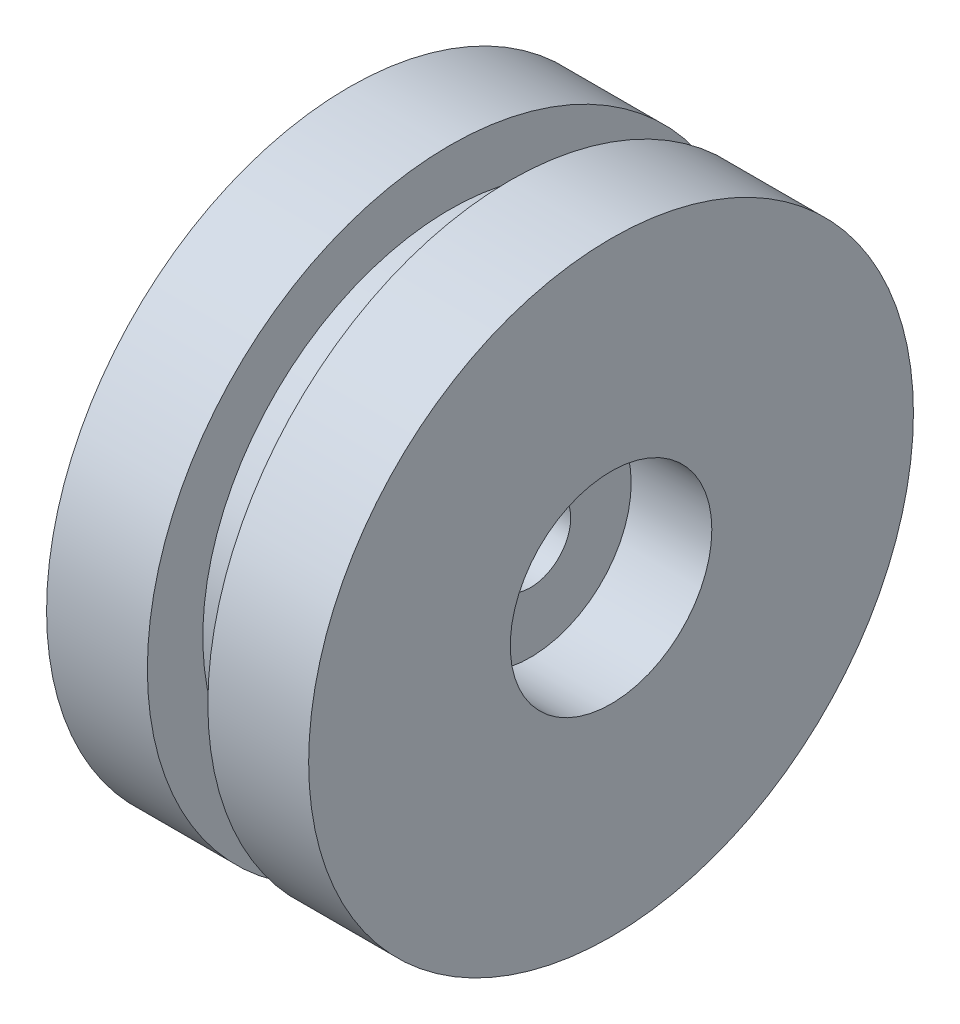
ISO-10303-21;
HEADER;
FILE_DESCRIPTION(('STEP AP214'),'2;1');
FILE_NAME('part.step','',(''),(''),'','','');
FILE_SCHEMA(('AUTOMOTIVE_DESIGN { 1 0 10303 214 1 1 1 1 }'));
ENDSEC;
DATA;
#1=APPLICATION_CONTEXT('core data for automotive mechanical design processes');
#2=APPLICATION_PROTOCOL_DEFINITION('international standard','automotive_design',2000,#1);
#3=PRODUCT_CONTEXT('',#1,'mechanical');
#4=PRODUCT('Part','Part','',(#3));
#5=PRODUCT_RELATED_PRODUCT_CATEGORY('part','',(#4));
#6=PRODUCT_DEFINITION_FORMATION('','',#4);
#7=PRODUCT_DEFINITION_CONTEXT('part definition',#1,'design');
#8=PRODUCT_DEFINITION('design','',#6,#7);
#9=PRODUCT_DEFINITION_SHAPE('','',#8);
#10=(LENGTH_UNIT() NAMED_UNIT(*) SI_UNIT(.MILLI.,.METRE.));
#11=(NAMED_UNIT(*) PLANE_ANGLE_UNIT() SI_UNIT($,.RADIAN.));
#12=(NAMED_UNIT(*) SI_UNIT($,.STERADIAN.) SOLID_ANGLE_UNIT());
#13=UNCERTAINTY_MEASURE_WITH_UNIT(LENGTH_MEASURE(1.E-05),#10,'distance_accuracy_value','');
#14=(GEOMETRIC_REPRESENTATION_CONTEXT(3) GLOBAL_UNCERTAINTY_ASSIGNED_CONTEXT((#13)) GLOBAL_UNIT_ASSIGNED_CONTEXT((#10,
#11,#12)) REPRESENTATION_CONTEXT('',''));
#15=CARTESIAN_POINT('',(0.,0.,0.));
#16=DIRECTION('',(0.,0.,1.));
#17=DIRECTION('',(1.,0.,0.));
#18=AXIS2_PLACEMENT_3D('',#15,#16,#17);
#19=CARTESIAN_POINT('',(6.5,0.,0.));
#20=DIRECTION('',(1.,0.,0.));
#21=DIRECTION('',(0.,0.,-1.));
#22=AXIS2_PLACEMENT_3D('',#19,#20,#21);
#23=CYLINDRICAL_SURFACE('',#22,15.);
#24=CARTESIAN_POINT('',(-6.5,0.,0.));
#25=DIRECTION('',(1.,0.,0.));
#26=DIRECTION('',(0.,0.,-1.));
#27=AXIS2_PLACEMENT_3D('',#24,#25,#26);
#28=CIRCLE('',#27,15.);
#29=CARTESIAN_POINT('',(-6.5,0.,-15.));
#30=VERTEX_POINT('',#29);
#31=EDGE_CURVE('E10',#30,#30,#28,.T.);
#32=ORIENTED_EDGE('',*,*,#31,.T.);
#33=EDGE_LOOP('',(#32));
#34=FACE_BOUND('',#33,.T.);
#35=CARTESIAN_POINT('',(-1.5,0.,0.));
#36=DIRECTION('',(1.,0.,0.));
#37=DIRECTION('',(0.,0.,-1.));
#38=AXIS2_PLACEMENT_3D('',#35,#36,#37);
#39=CIRCLE('',#38,15.);
#40=CARTESIAN_POINT('',(-1.5,0.,-15.));
#41=VERTEX_POINT('',#40);
#42=EDGE_CURVE('E57',#41,#41,#39,.T.);
#43=ORIENTED_EDGE('',*,*,#42,.F.);
#44=EDGE_LOOP('',(#43));
#45=FACE_BOUND('',#44,.T.);
#46=ADVANCED_FACE('F35',(#34,#45),#23,.T.);
#47=CARTESIAN_POINT('',(-6.5,15.,0.));
#48=DIRECTION('',(-1.,0.,0.));
#49=DIRECTION('',(0.,0.,1.));
#50=AXIS2_PLACEMENT_3D('',#47,#48,#49);
#51=PLANE('',#50);
#52=CARTESIAN_POINT('',(-6.5,0.,0.));
#53=DIRECTION('',(-1.,0.,0.));
#54=DIRECTION('',(0.,0.,1.));
#55=AXIS2_PLACEMENT_3D('',#52,#53,#54);
#56=CIRCLE('',#55,2.5);
#57=CARTESIAN_POINT('',(-6.5,0.,2.5));
#58=VERTEX_POINT('',#57);
#59=EDGE_CURVE('E70',#58,#58,#56,.T.);
#60=ORIENTED_EDGE('',*,*,#59,.F.);
#61=EDGE_LOOP('',(#60));
#62=FACE_BOUND('',#61,.T.);
#63=ORIENTED_EDGE('',*,*,#31,.F.);
#64=EDGE_LOOP('',(#63));
#65=FACE_BOUND('',#64,.T.);
#66=ADVANCED_FACE('F85',(#62,#65),#51,.T.);
#67=CARTESIAN_POINT('',(6.5,15.,0.));
#68=DIRECTION('',(1.,0.,0.));
#69=DIRECTION('',(0.,0.,-1.));
#70=AXIS2_PLACEMENT_3D('',#67,#68,#69);
#71=PLANE('',#70);
#72=CARTESIAN_POINT('',(6.5,0.,0.));
#73=DIRECTION('',(1.,0.,0.));
#74=DIRECTION('',(0.,0.,-1.));
#75=AXIS2_PLACEMENT_3D('',#72,#73,#74);
#76=CIRCLE('',#75,5.);
#77=CARTESIAN_POINT('',(6.5,0.,-5.));
#78=VERTEX_POINT('',#77);
#79=EDGE_CURVE('E61',#78,#78,#76,.T.);
#80=ORIENTED_EDGE('',*,*,#79,.F.);
#81=EDGE_LOOP('',(#80));
#82=FACE_BOUND('',#81,.T.);
#83=CARTESIAN_POINT('',(6.5,0.,0.));
#84=DIRECTION('',(1.,0.,0.));
#85=DIRECTION('',(0.,0.,-1.));
#86=AXIS2_PLACEMENT_3D('',#83,#84,#85);
#87=CIRCLE('',#86,15.);
#88=CARTESIAN_POINT('',(6.5,0.,-15.));
#89=VERTEX_POINT('',#88);
#90=EDGE_CURVE('E42',#89,#89,#87,.T.);
#91=ORIENTED_EDGE('',*,*,#90,.T.);
#92=EDGE_LOOP('',(#91));
#93=FACE_BOUND('',#92,.T.);
#94=ADVANCED_FACE('F88',(#82,#93),#71,.T.);
#95=CARTESIAN_POINT('',(6.5,0.,0.));
#96=DIRECTION('',(1.,0.,0.));
#97=DIRECTION('',(0.,0.,-1.));
#98=AXIS2_PLACEMENT_3D('',#95,#96,#97);
#99=CYLINDRICAL_SURFACE('',#98,15.);
#100=CARTESIAN_POINT('',(1.5,0.,0.));
#101=DIRECTION('',(1.,0.,0.));
#102=DIRECTION('',(0.,0.,-1.));
#103=AXIS2_PLACEMENT_3D('',#100,#101,#102);
#104=CIRCLE('',#103,15.);
#105=CARTESIAN_POINT('',(1.5,0.,-15.));
#106=VERTEX_POINT('',#105);
#107=EDGE_CURVE('E46',#106,#106,#104,.T.);
#108=ORIENTED_EDGE('',*,*,#107,.T.);
#109=EDGE_LOOP('',(#108));
#110=FACE_BOUND('',#109,.T.);
#111=ORIENTED_EDGE('',*,*,#90,.F.);
#112=EDGE_LOOP('',(#111));
#113=FACE_BOUND('',#112,.T.);
#114=ADVANCED_FACE('F93',(#110,#113),#99,.T.);
#115=CARTESIAN_POINT('',(1.5,15.,0.));
#116=DIRECTION('',(-1.,0.,0.));
#117=DIRECTION('',(0.,0.,1.));
#118=AXIS2_PLACEMENT_3D('',#115,#116,#117);
#119=PLANE('',#118);
#120=CARTESIAN_POINT('',(1.5,0.,0.));
#121=DIRECTION('',(1.,0.,0.));
#122=DIRECTION('',(0.,0.,-1.));
#123=AXIS2_PLACEMENT_3D('',#120,#121,#122);
#124=CIRCLE('',#123,12.25);
#125=CARTESIAN_POINT('',(1.5,0.,-12.25));
#126=VERTEX_POINT('',#125);
#127=EDGE_CURVE('E51',#126,#126,#124,.T.);
#128=ORIENTED_EDGE('',*,*,#127,.T.);
#129=EDGE_LOOP('',(#128));
#130=FACE_BOUND('',#129,.T.);
#131=ORIENTED_EDGE('',*,*,#107,.F.);
#132=EDGE_LOOP('',(#131));
#133=FACE_BOUND('',#132,.T.);
#134=ADVANCED_FACE('F99',(#130,#133),#119,.T.);
#135=CARTESIAN_POINT('',(6.5,0.,0.));
#136=DIRECTION('',(1.,0.,0.));
#137=DIRECTION('',(0.,0.,-1.));
#138=AXIS2_PLACEMENT_3D('',#135,#136,#137);
#139=CYLINDRICAL_SURFACE('',#138,12.25);
#140=CARTESIAN_POINT('',(-1.5,0.,0.));
#141=DIRECTION('',(1.,0.,0.));
#142=DIRECTION('',(0.,0.,-1.));
#143=AXIS2_PLACEMENT_3D('',#140,#141,#142);
#144=CIRCLE('',#143,12.25);
#145=CARTESIAN_POINT('',(-1.5,0.,-12.25));
#146=VERTEX_POINT('',#145);
#147=EDGE_CURVE('E54',#146,#146,#144,.T.);
#148=ORIENTED_EDGE('',*,*,#147,.T.);
#149=EDGE_LOOP('',(#148));
#150=FACE_BOUND('',#149,.T.);
#151=ORIENTED_EDGE('',*,*,#127,.F.);
#152=EDGE_LOOP('',(#151));
#153=FACE_BOUND('',#152,.T.);
#154=ADVANCED_FACE('F103',(#150,#153),#139,.T.);
#155=CARTESIAN_POINT('',(-1.5,15.,0.));
#156=DIRECTION('',(1.,0.,0.));
#157=DIRECTION('',(0.,0.,-1.));
#158=AXIS2_PLACEMENT_3D('',#155,#156,#157);
#159=PLANE('',#158);
#160=ORIENTED_EDGE('',*,*,#42,.T.);
#161=EDGE_LOOP('',(#160));
#162=FACE_BOUND('',#161,.T.);
#163=ORIENTED_EDGE('',*,*,#147,.F.);
#164=EDGE_LOOP('',(#163));
#165=FACE_BOUND('',#164,.T.);
#166=ADVANCED_FACE('F107',(#162,#165),#159,.T.);
#167=CARTESIAN_POINT('',(2.5,0.,0.));
#168=DIRECTION('',(1.,0.,0.));
#169=DIRECTION('',(0.,0.,-1.));
#170=AXIS2_PLACEMENT_3D('',#167,#168,#169);
#171=CYLINDRICAL_SURFACE('',#170,5.);
#172=CARTESIAN_POINT('',(2.5,0.,0.));
#173=DIRECTION('',(1.,0.,0.));
#174=DIRECTION('',(0.,0.,-1.));
#175=AXIS2_PLACEMENT_3D('',#172,#173,#174);
#176=CIRCLE('',#175,5.);
#177=CARTESIAN_POINT('',(2.5,0.,-5.));
#178=VERTEX_POINT('',#177);
#179=EDGE_CURVE('E60',#178,#178,#176,.T.);
#180=ORIENTED_EDGE('',*,*,#179,.F.);
#181=EDGE_LOOP('',(#180));
#182=FACE_BOUND('',#181,.T.);
#183=ORIENTED_EDGE('',*,*,#79,.T.);
#184=EDGE_LOOP('',(#183));
#185=FACE_BOUND('',#184,.T.);
#186=ADVANCED_FACE('F111',(#182,#185),#171,.F.);
#187=CARTESIAN_POINT('',(2.5,0.,0.));
#188=DIRECTION('',(1.,0.,0.));
#189=DIRECTION('',(0.,0.,-1.));
#190=AXIS2_PLACEMENT_3D('',#187,#188,#189);
#191=PLANE('',#190);
#192=CARTESIAN_POINT('',(2.5,0.,0.));
#193=DIRECTION('',(1.,0.,0.));
#194=DIRECTION('',(0.,0.,-1.));
#195=AXIS2_PLACEMENT_3D('',#192,#193,#194);
#196=CIRCLE('',#195,2.);
#197=CARTESIAN_POINT('',(2.5,0.,-2.));
#198=VERTEX_POINT('',#197);
#199=EDGE_CURVE('E38',#198,#198,#196,.T.);
#200=ORIENTED_EDGE('',*,*,#199,.F.);
#201=EDGE_LOOP('',(#200));
#202=FACE_BOUND('',#201,.T.);
#203=ORIENTED_EDGE('',*,*,#179,.T.);
#204=EDGE_LOOP('',(#203));
#205=FACE_BOUND('',#204,.T.);
#206=ADVANCED_FACE('F115',(#202,#205),#191,.T.);
#207=CARTESIAN_POINT('',(0.,0.,0.));
#208=DIRECTION('',(1.,0.,0.));
#209=DIRECTION('',(0.,0.,-1.));
#210=AXIS2_PLACEMENT_3D('',#207,#208,#209);
#211=CYLINDRICAL_SURFACE('',#210,2.);
#212=CARTESIAN_POINT('',(0.,0.,0.));
#213=DIRECTION('',(1.,0.,0.));
#214=DIRECTION('',(0.,0.,-1.));
#215=AXIS2_PLACEMENT_3D('',#212,#213,#214);
#216=CIRCLE('',#215,2.);
#217=CARTESIAN_POINT('',(0.,0.,-2.));
#218=VERTEX_POINT('',#217);
#219=EDGE_CURVE('E66',#218,#218,#216,.T.);
#220=CARTESIAN_POINT('',(2.5,0.,-2.));
#221=CARTESIAN_POINT('',(2.47395833333333,0.,-2.));
#222=CARTESIAN_POINT('',(2.44791666666667,0.,-2.));
#223=CARTESIAN_POINT('',(2.39583333333333,0.,-2.));
#224=CARTESIAN_POINT('',(2.36979166666667,0.,-2.));
#225=CARTESIAN_POINT('',(2.31770833333333,0.,-2.));
#226=CARTESIAN_POINT('',(2.29166666666667,0.,-2.));
#227=CARTESIAN_POINT('',(2.23958333333333,0.,-2.));
#228=CARTESIAN_POINT('',(2.21354166666667,0.,-2.));
#229=CARTESIAN_POINT('',(2.16145833333333,0.,-2.));
#230=CARTESIAN_POINT('',(2.13541666666667,0.,-2.));
#231=CARTESIAN_POINT('',(2.08333333333333,0.,-2.));
#232=CARTESIAN_POINT('',(2.05729166666667,0.,-2.));
#233=CARTESIAN_POINT('',(2.00520833333333,0.,-2.));
#234=CARTESIAN_POINT('',(1.97916666666667,0.,-2.));
#235=CARTESIAN_POINT('',(1.92708333333333,0.,-2.));
#236=CARTESIAN_POINT('',(1.90104166666667,0.,-2.));
#237=CARTESIAN_POINT('',(1.84895833333333,0.,-2.));
#238=CARTESIAN_POINT('',(1.82291666666667,0.,-2.));
#239=CARTESIAN_POINT('',(1.77083333333333,0.,-2.));
#240=CARTESIAN_POINT('',(1.74479166666667,0.,-2.));
#241=CARTESIAN_POINT('',(1.69270833333333,0.,-2.));
#242=CARTESIAN_POINT('',(1.66666666666667,0.,-2.));
#243=CARTESIAN_POINT('',(1.61458333333333,0.,-2.));
#244=CARTESIAN_POINT('',(1.58854166666667,0.,-2.));
#245=CARTESIAN_POINT('',(1.53645833333333,0.,-2.));
#246=CARTESIAN_POINT('',(1.51041666666667,0.,-2.));
#247=CARTESIAN_POINT('',(1.45833333333333,0.,-2.));
#248=CARTESIAN_POINT('',(1.43229166666667,0.,-2.));
#249=CARTESIAN_POINT('',(1.38020833333333,0.,-2.));
#250=CARTESIAN_POINT('',(1.35416666666667,0.,-2.));
#251=CARTESIAN_POINT('',(1.30208333333333,0.,-2.));
#252=CARTESIAN_POINT('',(1.27604166666667,0.,-2.));
#253=CARTESIAN_POINT('',(1.22395833333333,0.,-2.));
#254=CARTESIAN_POINT('',(1.19791666666667,0.,-2.));
#255=CARTESIAN_POINT('',(1.14583333333333,0.,-2.));
#256=CARTESIAN_POINT('',(1.11979166666667,0.,-2.));
#257=CARTESIAN_POINT('',(1.06770833333333,0.,-2.));
#258=CARTESIAN_POINT('',(1.04166666666667,0.,-2.));
#259=CARTESIAN_POINT('',(0.989583333333333,0.,-2.));
#260=CARTESIAN_POINT('',(0.963541666666667,0.,-2.));
#261=CARTESIAN_POINT('',(0.911458333333333,0.,-2.));
#262=CARTESIAN_POINT('',(0.885416666666667,0.,-2.));
#263=CARTESIAN_POINT('',(0.833333333333333,0.,-2.));
#264=CARTESIAN_POINT('',(0.807291666666666,0.,-2.));
#265=CARTESIAN_POINT('',(0.755208333333333,0.,-2.));
#266=CARTESIAN_POINT('',(0.729166666666667,0.,-2.));
#267=CARTESIAN_POINT('',(0.677083333333333,0.,-2.));
#268=CARTESIAN_POINT('',(0.651041666666667,0.,-2.));
#269=CARTESIAN_POINT('',(0.598958333333333,0.,-2.));
#270=CARTESIAN_POINT('',(0.572916666666666,0.,-2.));
#271=CARTESIAN_POINT('',(0.520833333333333,0.,-2.));
#272=CARTESIAN_POINT('',(0.494791666666667,0.,-2.));
#273=CARTESIAN_POINT('',(0.442708333333333,0.,-2.));
#274=CARTESIAN_POINT('',(0.416666666666667,0.,-2.));
#275=CARTESIAN_POINT('',(0.364583333333333,0.,-2.));
#276=CARTESIAN_POINT('',(0.338541666666666,0.,-2.));
#277=CARTESIAN_POINT('',(0.286458333333333,0.,-2.));
#278=CARTESIAN_POINT('',(0.260416666666666,0.,-2.));
#279=CARTESIAN_POINT('',(0.208333333333333,0.,-2.));
#280=CARTESIAN_POINT('',(0.182291666666667,0.,-2.));
#281=CARTESIAN_POINT('',(0.130208333333333,0.,-2.));
#282=CARTESIAN_POINT('',(0.104166666666667,0.,-2.));
#283=CARTESIAN_POINT('',(0.0520833333333334,0.,-2.));
#284=CARTESIAN_POINT('',(0.0260416666666667,0.,-2.));
#285=CARTESIAN_POINT('',(0.,0.,-2.));
#286=B_SPLINE_CURVE_WITH_KNOTS('',3,(#220,#221,#222,#223,#224,#225,#226,#227,#228,#229,#230,
#231,#232,#233,#234,#235,#236,#237,#238,#239,#240,#241,#242,#243,#244,#245,#246,#247,#248,#249,
#250,#251,#252,#253,#254,#255,#256,#257,#258,#259,#260,#261,#262,#263,#264,#265,#266,#267,#268,
#269,#270,#271,#272,#273,#274,#275,#276,#277,#278,#279,#280,#281,#282,#283,#284,#285),
.UNSPECIFIED.,.F.,.F.,(4,2,2,2,2,2,2,2,2,2,2,2,2,2,2,2,2,2,2,2,2,2,2,2,2,2,2,2,2,2,2,2,4),(0.,
0.0781250000000001,0.15625,0.234375,0.3125,0.390625,0.46875,0.546875,0.625,0.703125,0.78125,
0.859375,0.9375,1.015625,1.09375,1.171875,1.25,1.328125,1.40625,1.484375,1.5625,1.640625,
1.71875,1.796875,1.875,1.953125,2.03125,2.109375,2.1875,2.265625,2.34375,2.421875,2.5),.UNSPECIFIED.);
#287=EDGE_CURVE('BSEAM119',#198,#218,#286,.T.);
#288=ORIENTED_EDGE('',*,*,#199,.T.);
#289=ORIENTED_EDGE('',*,*,#219,.F.);
#290=ORIENTED_EDGE('',*,*,#287,.T.);
#291=ORIENTED_EDGE('',*,*,#287,.F.);
#292=EDGE_LOOP('',(#288,#290,#289,#291));
#293=FACE_BOUND('',#292,.T.);
#294=ADVANCED_FACE('F119',(#293),#211,.F.);
#295=CARTESIAN_POINT('',(0.,0.,0.));
#296=DIRECTION('',(-1.,0.,0.));
#297=DIRECTION('',(0.,0.,1.));
#298=AXIS2_PLACEMENT_3D('',#295,#296,#297);
#299=PLANE('',#298);
#300=CARTESIAN_POINT('',(0.,0.,0.));
#301=DIRECTION('',(-1.,0.,0.));
#302=DIRECTION('',(0.,0.,1.));
#303=AXIS2_PLACEMENT_3D('',#300,#301,#302);
#304=CIRCLE('',#303,2.5);
#305=CARTESIAN_POINT('',(0.,0.,2.5));
#306=VERTEX_POINT('',#305);
#307=EDGE_CURVE('E69',#306,#306,#304,.T.);
#308=ORIENTED_EDGE('',*,*,#307,.T.);
#309=EDGE_LOOP('',(#308));
#310=FACE_BOUND('',#309,.T.);
#311=ORIENTED_EDGE('',*,*,#219,.T.);
#312=EDGE_LOOP('',(#311));
#313=FACE_BOUND('',#312,.T.);
#314=ADVANCED_FACE('F76',(#310,#313),#299,.T.);
#315=CARTESIAN_POINT('',(0.,0.,0.));
#316=DIRECTION('',(-1.,0.,0.));
#317=DIRECTION('',(0.,0.,1.));
#318=AXIS2_PLACEMENT_3D('',#315,#316,#317);
#319=CYLINDRICAL_SURFACE('',#318,2.5);
#320=CARTESIAN_POINT('',(0.,0.,2.5));
#321=CARTESIAN_POINT('',(-0.0677083333333332,0.,2.5));
#322=CARTESIAN_POINT('',(-0.135416666666667,0.,2.5));
#323=CARTESIAN_POINT('',(-0.270833333333333,0.,2.5));
#324=CARTESIAN_POINT('',(-0.338541666666667,0.,2.5));
#325=CARTESIAN_POINT('',(-0.473958333333333,0.,2.5));
#326=CARTESIAN_POINT('',(-0.541666666666667,0.,2.5));
#327=CARTESIAN_POINT('',(-0.677083333333333,0.,2.5));
#328=CARTESIAN_POINT('',(-0.744791666666667,0.,2.5));
#329=CARTESIAN_POINT('',(-0.880208333333333,0.,2.5));
#330=CARTESIAN_POINT('',(-0.947916666666667,0.,2.5));
#331=CARTESIAN_POINT('',(-1.08333333333333,0.,2.5));
#332=CARTESIAN_POINT('',(-1.15104166666667,0.,2.5));
#333=CARTESIAN_POINT('',(-1.28645833333333,0.,2.5));
#334=CARTESIAN_POINT('',(-1.35416666666667,0.,2.5));
#335=CARTESIAN_POINT('',(-1.48958333333333,0.,2.5));
#336=CARTESIAN_POINT('',(-1.55729166666667,0.,2.5));
#337=CARTESIAN_POINT('',(-1.69270833333333,0.,2.5));
#338=CARTESIAN_POINT('',(-1.76041666666667,0.,2.5));
#339=CARTESIAN_POINT('',(-1.89583333333333,0.,2.5));
#340=CARTESIAN_POINT('',(-1.96354166666667,0.,2.5));
#341=CARTESIAN_POINT('',(-2.09895833333333,0.,2.5));
#342=CARTESIAN_POINT('',(-2.16666666666667,0.,2.5));
#343=CARTESIAN_POINT('',(-2.30208333333333,0.,2.5));
#344=CARTESIAN_POINT('',(-2.36979166666667,0.,2.5));
#345=CARTESIAN_POINT('',(-2.50520833333333,0.,2.5));
#346=CARTESIAN_POINT('',(-2.57291666666667,0.,2.5));
#347=CARTESIAN_POINT('',(-2.70833333333333,0.,2.5));
#348=CARTESIAN_POINT('',(-2.77604166666667,0.,2.5));
#349=CARTESIAN_POINT('',(-2.91145833333333,0.,2.5));
#350=CARTESIAN_POINT('',(-2.97916666666667,0.,2.5));
#351=CARTESIAN_POINT('',(-3.11458333333333,0.,2.5));
#352=CARTESIAN_POINT('',(-3.18229166666667,0.,2.5));
#353=CARTESIAN_POINT('',(-3.31770833333333,0.,2.5));
#354=CARTESIAN_POINT('',(-3.38541666666667,0.,2.5));
#355=CARTESIAN_POINT('',(-3.52083333333333,0.,2.5));
#356=CARTESIAN_POINT('',(-3.58854166666667,0.,2.5));
#357=CARTESIAN_POINT('',(-3.72395833333333,0.,2.5));
#358=CARTESIAN_POINT('',(-3.79166666666667,0.,2.5));
#359=CARTESIAN_POINT('',(-3.92708333333333,0.,2.5));
#360=CARTESIAN_POINT('',(-3.99479166666667,0.,2.5));
#361=CARTESIAN_POINT('',(-4.13020833333333,0.,2.5));
#362=CARTESIAN_POINT('',(-4.19791666666667,0.,2.5));
#363=CARTESIAN_POINT('',(-4.33333333333333,0.,2.5));
#364=CARTESIAN_POINT('',(-4.40104166666667,0.,2.5));
#365=CARTESIAN_POINT('',(-4.53645833333333,0.,2.5));
#366=CARTESIAN_POINT('',(-4.60416666666667,0.,2.5));
#367=CARTESIAN_POINT('',(-4.73958333333333,0.,2.5));
#368=CARTESIAN_POINT('',(-4.80729166666667,0.,2.5));
#369=CARTESIAN_POINT('',(-4.94270833333333,0.,2.5));
#370=CARTESIAN_POINT('',(-5.01041666666667,0.,2.5));
#371=CARTESIAN_POINT('',(-5.14583333333333,0.,2.5));
#372=CARTESIAN_POINT('',(-5.21354166666667,0.,2.5));
#373=CARTESIAN_POINT('',(-5.34895833333333,0.,2.5));
#374=CARTESIAN_POINT('',(-5.41666666666667,0.,2.5));
#375=CARTESIAN_POINT('',(-5.55208333333333,0.,2.5));
#376=CARTESIAN_POINT('',(-5.61979166666667,0.,2.5));
#377=CARTESIAN_POINT('',(-5.75520833333333,0.,2.5));
#378=CARTESIAN_POINT('',(-5.82291666666667,0.,2.5));
#379=CARTESIAN_POINT('',(-5.95833333333333,0.,2.5));
#380=CARTESIAN_POINT('',(-6.02604166666667,0.,2.5));
#381=CARTESIAN_POINT('',(-6.16145833333333,0.,2.5));
#382=CARTESIAN_POINT('',(-6.22916666666667,0.,2.5));
#383=CARTESIAN_POINT('',(-6.36458333333333,0.,2.5));
#384=CARTESIAN_POINT('',(-6.43229166666667,0.,2.5));
#385=CARTESIAN_POINT('',(-6.5,0.,2.5));
#386=B_SPLINE_CURVE_WITH_KNOTS('',3,(#320,#321,#322,#323,#324,#325,#326,#327,#328,#329,#330,
#331,#332,#333,#334,#335,#336,#337,#338,#339,#340,#341,#342,#343,#344,#345,#346,#347,#348,#349,
#350,#351,#352,#353,#354,#355,#356,#357,#358,#359,#360,#361,#362,#363,#364,#365,#366,#367,#368,
#369,#370,#371,#372,#373,#374,#375,#376,#377,#378,#379,#380,#381,#382,#383,#384,#385),
.UNSPECIFIED.,.F.,.F.,(4,2,2,2,2,2,2,2,2,2,2,2,2,2,2,2,2,2,2,2,2,2,2,2,2,2,2,2,2,2,2,2,4),(0.,
0.203125,0.40625,0.609375,0.8125,1.015625,1.21875,1.421875,1.625,1.828125,2.03125,2.234375,
2.4375,2.640625,2.84375,3.046875,3.25,3.453125,3.65625,3.859375,4.0625,4.265625,4.46875,
4.671875,4.875,5.078125,5.28125,5.484375,5.6875,5.890625,6.09375,6.296875,6.5),.UNSPECIFIED.);
#387=EDGE_CURVE('BSEAM79',#306,#58,#386,.T.);
#388=ORIENTED_EDGE('',*,*,#307,.F.);
#389=ORIENTED_EDGE('',*,*,#59,.T.);
#390=ORIENTED_EDGE('',*,*,#387,.T.);
#391=ORIENTED_EDGE('',*,*,#387,.F.);
#392=EDGE_LOOP('',(#388,#390,#389,#391));
#393=FACE_BOUND('',#392,.T.);
#394=ADVANCED_FACE('F79',(#393),#319,.F.);
#395=CLOSED_SHELL('',(#46,#66,#94,#114,#134,#154,#166,#186,#206,#294,#314,#394));
#396=MANIFOLD_SOLID_BREP('B2',#395);
#397=ADVANCED_BREP_SHAPE_REPRESENTATION('',(#18,#396),#14);
#398=SHAPE_DEFINITION_REPRESENTATION(#9,#397);
ENDSEC;
END-ISO-10303-21;
